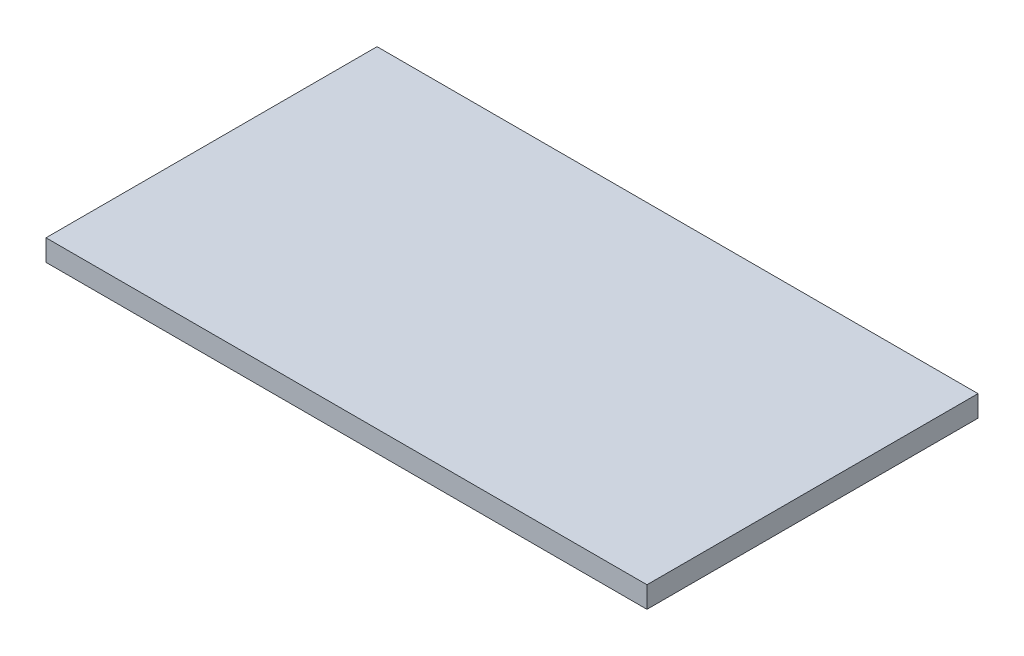
ISO-10303-21;
HEADER;
FILE_DESCRIPTION(('STEP AP214'),'2;1');
FILE_NAME('part.step','',(''),(''),'','','');
FILE_SCHEMA(('AUTOMOTIVE_DESIGN { 1 0 10303 214 1 1 1 1 }'));
ENDSEC;
DATA;
#1=APPLICATION_CONTEXT('core data for automotive mechanical design processes');
#2=APPLICATION_PROTOCOL_DEFINITION('international standard','automotive_design',2000,#1);
#3=PRODUCT_CONTEXT('',#1,'mechanical');
#4=PRODUCT('Part','Part','',(#3));
#5=PRODUCT_RELATED_PRODUCT_CATEGORY('part','',(#4));
#6=PRODUCT_DEFINITION_FORMATION('','',#4);
#7=PRODUCT_DEFINITION_CONTEXT('part definition',#1,'design');
#8=PRODUCT_DEFINITION('design','',#6,#7);
#9=PRODUCT_DEFINITION_SHAPE('','',#8);
#10=(LENGTH_UNIT() NAMED_UNIT(*) SI_UNIT(.MILLI.,.METRE.));
#11=(NAMED_UNIT(*) PLANE_ANGLE_UNIT() SI_UNIT($,.RADIAN.));
#12=(NAMED_UNIT(*) SI_UNIT($,.STERADIAN.) SOLID_ANGLE_UNIT());
#13=UNCERTAINTY_MEASURE_WITH_UNIT(LENGTH_MEASURE(1.E-05),#10,'distance_accuracy_value','');
#14=(GEOMETRIC_REPRESENTATION_CONTEXT(3) GLOBAL_UNCERTAINTY_ASSIGNED_CONTEXT((#13)) GLOBAL_UNIT_ASSIGNED_CONTEXT((#10,
#11,#12)) REPRESENTATION_CONTEXT('',''));
#15=CARTESIAN_POINT('',(0.,0.,0.));
#16=DIRECTION('',(0.,0.,1.));
#17=DIRECTION('',(1.,0.,0.));
#18=AXIS2_PLACEMENT_3D('',#15,#16,#17);
#19=CARTESIAN_POINT('',(0.,1.5,0.));
#20=DIRECTION('',(1.,0.,0.));
#21=DIRECTION('',(0.,0.,-1.));
#22=AXIS2_PLACEMENT_3D('',#19,#20,#21);
#23=PLANE('',#22);
#24=DIRECTION('',(0.,0.,1.));
#25=VECTOR('',#24,1.);
#26=CARTESIAN_POINT('',(0.,0.,0.));
#27=LINE('',#26,#25);
#28=CARTESIAN_POINT('',(0.,0.,0.));
#29=VERTEX_POINT('',#28);
#30=CARTESIAN_POINT('',(0.,0.,23.3));
#31=VERTEX_POINT('',#30);
#32=EDGE_CURVE('E96',#29,#31,#27,.T.);
#33=ORIENTED_EDGE('',*,*,#32,.T.);
#34=DIRECTION('',(0.,-1.,0.));
#35=VECTOR('',#34,1.);
#36=CARTESIAN_POINT('',(0.,1.5,23.3));
#37=LINE('',#36,#35);
#38=CARTESIAN_POINT('',(0.,1.5,23.3));
#39=VERTEX_POINT('',#38);
#40=EDGE_CURVE('E11',#39,#31,#37,.T.);
#41=ORIENTED_EDGE('',*,*,#40,.F.);
#42=DIRECTION('',(0.,0.,1.));
#43=VECTOR('',#42,1.);
#44=CARTESIAN_POINT('',(0.,1.5,0.));
#45=LINE('',#44,#43);
#46=CARTESIAN_POINT('',(0.,1.5,0.));
#47=VERTEX_POINT('',#46);
#48=EDGE_CURVE('E84',#47,#39,#45,.T.);
#49=ORIENTED_EDGE('',*,*,#48,.F.);
#50=DIRECTION('',(0.,-1.,0.));
#51=VECTOR('',#50,1.);
#52=CARTESIAN_POINT('',(0.,1.5,0.));
#53=LINE('',#52,#51);
#54=EDGE_CURVE('E92',#47,#29,#53,.T.);
#55=ORIENTED_EDGE('',*,*,#54,.T.);
#56=EDGE_LOOP('',(#33,#41,#49,#55));
#57=FACE_BOUND('',#56,.T.);
#58=ADVANCED_FACE('F33',(#57),#23,.F.);
#59=CARTESIAN_POINT('',(0.,1.5,23.3));
#60=DIRECTION('',(0.,0.,-1.));
#61=DIRECTION('',(-1.,0.,0.));
#62=AXIS2_PLACEMENT_3D('',#59,#60,#61);
#63=PLANE('',#62);
#64=DIRECTION('',(1.,0.,0.));
#65=VECTOR('',#64,1.);
#66=CARTESIAN_POINT('',(0.,0.,23.3));
#67=LINE('',#66,#65);
#68=CARTESIAN_POINT('',(42.3,0.,23.3));
#69=VERTEX_POINT('',#68);
#70=EDGE_CURVE('E88',#31,#69,#67,.T.);
#71=ORIENTED_EDGE('',*,*,#70,.T.);
#72=DIRECTION('',(0.,-1.,0.));
#73=VECTOR('',#72,1.);
#74=CARTESIAN_POINT('',(42.3,1.5,23.3));
#75=LINE('',#74,#73);
#76=CARTESIAN_POINT('',(42.3,1.5,23.3));
#77=VERTEX_POINT('',#76);
#78=EDGE_CURVE('E41',#77,#69,#75,.T.);
#79=ORIENTED_EDGE('',*,*,#78,.F.);
#80=DIRECTION('',(1.,0.,0.));
#81=VECTOR('',#80,1.);
#82=CARTESIAN_POINT('',(0.,1.5,23.3));
#83=LINE('',#82,#81);
#84=EDGE_CURVE('E79',#39,#77,#83,.T.);
#85=ORIENTED_EDGE('',*,*,#84,.F.);
#86=ORIENTED_EDGE('',*,*,#40,.T.);
#87=EDGE_LOOP('',(#71,#79,#85,#86));
#88=FACE_BOUND('',#87,.T.);
#89=ADVANCED_FACE('F87',(#88),#63,.F.);
#90=CARTESIAN_POINT('',(42.3,1.5,0.));
#91=DIRECTION('',(-1.,0.,0.));
#92=DIRECTION('',(0.,0.,1.));
#93=AXIS2_PLACEMENT_3D('',#90,#91,#92);
#94=PLANE('',#93);
#95=DIRECTION('',(0.,0.,-1.));
#96=VECTOR('',#95,1.);
#97=CARTESIAN_POINT('',(42.3,0.,0.));
#98=LINE('',#97,#96);
#99=CARTESIAN_POINT('',(42.3,0.,0.));
#100=VERTEX_POINT('',#99);
#101=EDGE_CURVE('E66',#69,#100,#98,.T.);
#102=ORIENTED_EDGE('',*,*,#101,.T.);
#103=DIRECTION('',(0.,-1.,0.));
#104=VECTOR('',#103,1.);
#105=CARTESIAN_POINT('',(42.3,1.5,0.));
#106=LINE('',#105,#104);
#107=CARTESIAN_POINT('',(42.3,1.5,0.));
#108=VERTEX_POINT('',#107);
#109=EDGE_CURVE('E89',#108,#100,#106,.T.);
#110=ORIENTED_EDGE('',*,*,#109,.F.);
#111=DIRECTION('',(0.,0.,-1.));
#112=VECTOR('',#111,1.);
#113=CARTESIAN_POINT('',(42.3,1.5,0.));
#114=LINE('',#113,#112);
#115=EDGE_CURVE('E82',#77,#108,#114,.T.);
#116=ORIENTED_EDGE('',*,*,#115,.F.);
#117=ORIENTED_EDGE('',*,*,#78,.T.);
#118=EDGE_LOOP('',(#102,#110,#116,#117));
#119=FACE_BOUND('',#118,.T.);
#120=ADVANCED_FACE('F90',(#119),#94,.F.);
#121=CARTESIAN_POINT('',(0.,1.5,0.));
#122=DIRECTION('',(0.,0.,1.));
#123=DIRECTION('',(1.,0.,0.));
#124=AXIS2_PLACEMENT_3D('',#121,#122,#123);
#125=PLANE('',#124);
#126=DIRECTION('',(-1.,0.,0.));
#127=VECTOR('',#126,1.);
#128=CARTESIAN_POINT('',(0.,0.,0.));
#129=LINE('',#128,#127);
#130=EDGE_CURVE('E72',#100,#29,#129,.T.);
#131=ORIENTED_EDGE('',*,*,#130,.T.);
#132=ORIENTED_EDGE('',*,*,#54,.F.);
#133=DIRECTION('',(-1.,0.,0.));
#134=VECTOR('',#133,1.);
#135=CARTESIAN_POINT('',(0.,1.5,0.));
#136=LINE('',#135,#134);
#137=EDGE_CURVE('E49',#108,#47,#136,.T.);
#138=ORIENTED_EDGE('',*,*,#137,.F.);
#139=ORIENTED_EDGE('',*,*,#109,.T.);
#140=EDGE_LOOP('',(#131,#132,#138,#139));
#141=FACE_BOUND('',#140,.T.);
#142=ADVANCED_FACE('F103',(#141),#125,.F.);
#143=CARTESIAN_POINT('',(0.,1.5,0.));
#144=DIRECTION('',(0.,1.,0.));
#145=DIRECTION('',(0.,0.,1.));
#146=AXIS2_PLACEMENT_3D('',#143,#144,#145);
#147=PLANE('',#146);
#148=ORIENTED_EDGE('',*,*,#48,.T.);
#149=ORIENTED_EDGE('',*,*,#84,.T.);
#150=ORIENTED_EDGE('',*,*,#115,.T.);
#151=ORIENTED_EDGE('',*,*,#137,.T.);
#152=EDGE_LOOP('',(#148,#149,#150,#151));
#153=FACE_BOUND('',#152,.T.);
#154=ADVANCED_FACE('F80',(#153),#147,.T.);
#155=CARTESIAN_POINT('',(0.,0.,0.));
#156=DIRECTION('',(0.,1.,0.));
#157=DIRECTION('',(0.,0.,1.));
#158=AXIS2_PLACEMENT_3D('',#155,#156,#157);
#159=PLANE('',#158);
#160=ORIENTED_EDGE('',*,*,#32,.F.);
#161=ORIENTED_EDGE('',*,*,#130,.F.);
#162=ORIENTED_EDGE('',*,*,#101,.F.);
#163=ORIENTED_EDGE('',*,*,#70,.F.);
#164=EDGE_LOOP('',(#160,#161,#162,#163));
#165=FACE_BOUND('',#164,.T.);
#166=ADVANCED_FACE('F106',(#165),#159,.F.);
#167=CLOSED_SHELL('',(#58,#89,#120,#142,#154,#166));
#168=MANIFOLD_SOLID_BREP('B2',#167);
#169=ADVANCED_BREP_SHAPE_REPRESENTATION('',(#18,#168),#14);
#170=SHAPE_DEFINITION_REPRESENTATION(#9,#169);
ENDSEC;
END-ISO-10303-21;
